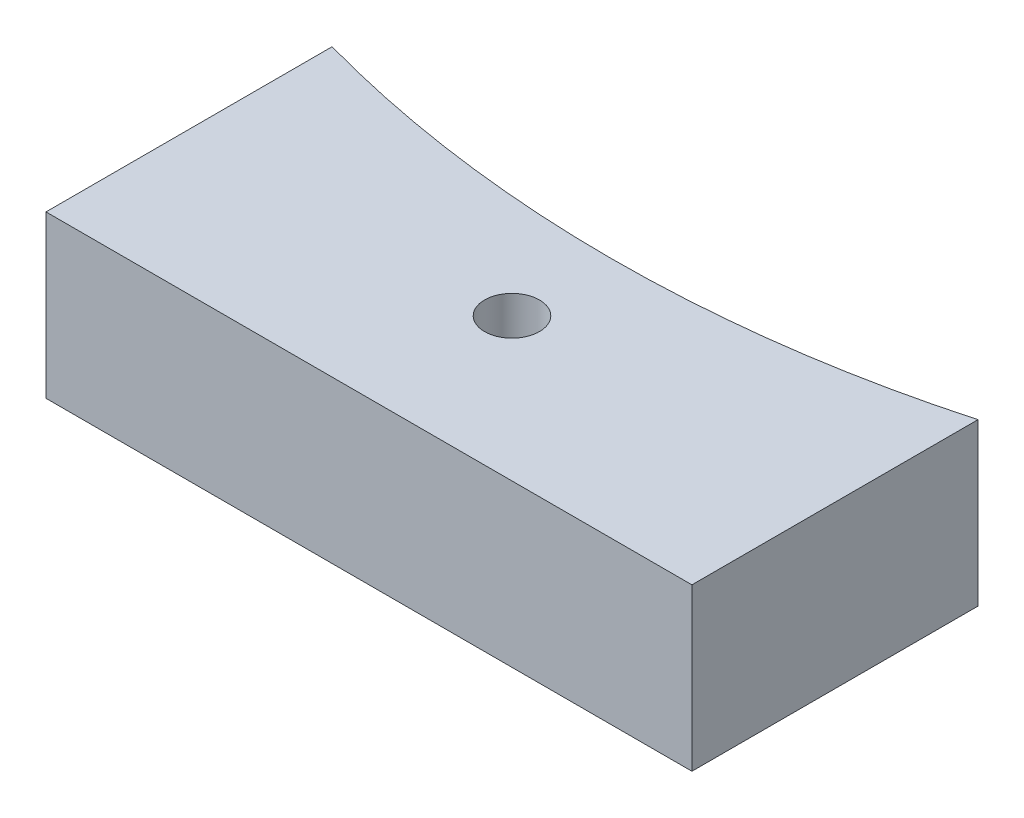
ISO-10303-21;
HEADER;
FILE_DESCRIPTION(('STEP AP214'),'2;1');
FILE_NAME('part.step','',(''),(''),'','','');
FILE_SCHEMA(('AUTOMOTIVE_DESIGN { 1 0 10303 214 1 1 1 1 }'));
ENDSEC;
DATA;
#1=APPLICATION_CONTEXT('core data for automotive mechanical design processes');
#2=APPLICATION_PROTOCOL_DEFINITION('international standard','automotive_design',2000,#1);
#3=PRODUCT_CONTEXT('',#1,'mechanical');
#4=PRODUCT('Part','Part','',(#3));
#5=PRODUCT_RELATED_PRODUCT_CATEGORY('part','',(#4));
#6=PRODUCT_DEFINITION_FORMATION('','',#4);
#7=PRODUCT_DEFINITION_CONTEXT('part definition',#1,'design');
#8=PRODUCT_DEFINITION('design','',#6,#7);
#9=PRODUCT_DEFINITION_SHAPE('','',#8);
#10=(LENGTH_UNIT() NAMED_UNIT(*) SI_UNIT(.MILLI.,.METRE.));
#11=(NAMED_UNIT(*) PLANE_ANGLE_UNIT() SI_UNIT($,.RADIAN.));
#12=(NAMED_UNIT(*) SI_UNIT($,.STERADIAN.) SOLID_ANGLE_UNIT());
#13=UNCERTAINTY_MEASURE_WITH_UNIT(LENGTH_MEASURE(1.E-05),#10,'distance_accuracy_value','');
#14=(GEOMETRIC_REPRESENTATION_CONTEXT(3) GLOBAL_UNCERTAINTY_ASSIGNED_CONTEXT((#13)) GLOBAL_UNIT_ASSIGNED_CONTEXT((#10,
#11,#12)) REPRESENTATION_CONTEXT('',''));
#15=CARTESIAN_POINT('',(0.,0.,0.));
#16=DIRECTION('',(0.,0.,1.));
#17=DIRECTION('',(1.,0.,0.));
#18=AXIS2_PLACEMENT_3D('',#15,#16,#17);
#19=CARTESIAN_POINT('',(39.99999998056,0.,-500000.));
#20=DIRECTION('',(1.,0.,0.));
#21=DIRECTION('',(0.,0.,-1.));
#22=AXIS2_PLACEMENT_3D('',#19,#20,#21);
#23=PLANE('',#22);
#24=DIRECTION('',(0.,1.,0.));
#25=VECTOR('',#24,1.);
#26=CARTESIAN_POINT('',(39.99999998056,0.,180.));
#27=LINE('',#26,#25);
#28=CARTESIAN_POINT('',(39.99999998056,20.,180.));
#29=VERTEX_POINT('',#28);
#30=CARTESIAN_POINT('',(39.99999998056,40.,180.));
#31=VERTEX_POINT('',#30);
#32=EDGE_CURVE('E84',#29,#31,#27,.T.);
#33=ORIENTED_EDGE('',*,*,#32,.F.);
#34=DIRECTION('',(0.,0.,1.));
#35=VECTOR('',#34,1.);
#36=CARTESIAN_POINT('',(39.99999998056,20.,144.568322953388));
#37=LINE('',#36,#35);
#38=CARTESIAN_POINT('',(39.99999998056,20.,144.568322953388));
#39=VERTEX_POINT('',#38);
#40=EDGE_CURVE('E75',#39,#29,#37,.T.);
#41=ORIENTED_EDGE('',*,*,#40,.F.);
#42=DIRECTION('',(0.,-1.,0.));
#43=VECTOR('',#42,1.);
#44=CARTESIAN_POINT('',(39.99999998056,70.,144.568322953388));
#45=LINE('',#44,#43);
#46=CARTESIAN_POINT('',(39.99999998056,40.,144.568322953388));
#47=VERTEX_POINT('',#46);
#48=EDGE_CURVE('E42',#47,#39,#45,.T.);
#49=ORIENTED_EDGE('',*,*,#48,.F.);
#50=DIRECTION('',(0.,0.,1.));
#51=VECTOR('',#50,1.);
#52=CARTESIAN_POINT('',(39.99999998056,40.,-500000.));
#53=LINE('',#52,#51);
#54=EDGE_CURVE('E88',#47,#31,#53,.T.);
#55=ORIENTED_EDGE('',*,*,#54,.T.);
#56=EDGE_LOOP('',(#33,#41,#49,#55));
#57=FACE_BOUND('',#56,.T.);
#58=ADVANCED_FACE('F33',(#57),#23,.T.);
#59=CARTESIAN_POINT('',(0.,0.,180.));
#60=DIRECTION('',(0.,0.,1.));
#61=DIRECTION('',(1.,0.,0.));
#62=AXIS2_PLACEMENT_3D('',#59,#60,#61);
#63=PLANE('',#62);
#64=DIRECTION('',(0.,-1.,0.));
#65=VECTOR('',#64,1.);
#66=CARTESIAN_POINT('',(-39.99999996112,40.,180.));
#67=LINE('',#66,#65);
#68=CARTESIAN_POINT('',(-39.99999996112,40.,180.));
#69=VERTEX_POINT('',#68);
#70=CARTESIAN_POINT('',(-39.99999996112,20.,180.));
#71=VERTEX_POINT('',#70);
#72=EDGE_CURVE('E94',#69,#71,#67,.T.);
#73=ORIENTED_EDGE('',*,*,#72,.T.);
#74=DIRECTION('',(-1.,0.,0.));
#75=VECTOR('',#74,1.);
#76=CARTESIAN_POINT('',(39.99999998056,20.,180.));
#77=LINE('',#76,#75);
#78=EDGE_CURVE('E85',#29,#71,#77,.T.);
#79=ORIENTED_EDGE('',*,*,#78,.F.);
#80=ORIENTED_EDGE('',*,*,#32,.T.);
#81=DIRECTION('',(-1.,0.,0.));
#82=VECTOR('',#81,1.);
#83=CARTESIAN_POINT('',(39.99999998056,40.,180.));
#84=LINE('',#83,#82);
#85=EDGE_CURVE('E93',#31,#69,#84,.T.);
#86=ORIENTED_EDGE('',*,*,#85,.T.);
#87=EDGE_LOOP('',(#73,#79,#80,#86));
#88=FACE_BOUND('',#87,.T.);
#89=ADVANCED_FACE('F111',(#88),#63,.T.);
#90=CARTESIAN_POINT('',(-39.99999996112,40.,-500000.));
#91=DIRECTION('',(-1.,0.,0.));
#92=DIRECTION('',(0.,-1.,0.));
#93=AXIS2_PLACEMENT_3D('',#90,#91,#92);
#94=PLANE('',#93);
#95=DIRECTION('',(0.,-1.,0.));
#96=VECTOR('',#95,1.);
#97=CARTESIAN_POINT('',(-39.99999996112,70.,144.568322958767));
#98=LINE('',#97,#96);
#99=CARTESIAN_POINT('',(-39.99999996112,20.,144.568322958767));
#100=VERTEX_POINT('',#99);
#101=CARTESIAN_POINT('',(-39.99999996112,40.,144.568322958767));
#102=VERTEX_POINT('',#101);
#103=EDGE_CURVE('E37',#100,#102,#98,.F.);
#104=ORIENTED_EDGE('',*,*,#103,.F.);
#105=DIRECTION('',(0.,0.,-1.));
#106=VECTOR('',#105,1.);
#107=CARTESIAN_POINT('',(-39.99999996112,20.,180.));
#108=LINE('',#107,#106);
#109=EDGE_CURVE('E50',#71,#100,#108,.T.);
#110=ORIENTED_EDGE('',*,*,#109,.F.);
#111=ORIENTED_EDGE('',*,*,#72,.F.);
#112=DIRECTION('',(0.,0.,1.));
#113=VECTOR('',#112,1.);
#114=CARTESIAN_POINT('',(-39.99999996112,40.,-500000.));
#115=LINE('',#114,#113);
#116=EDGE_CURVE('E91',#102,#69,#115,.T.);
#117=ORIENTED_EDGE('',*,*,#116,.F.);
#118=EDGE_LOOP('',(#104,#110,#111,#117));
#119=FACE_BOUND('',#118,.T.);
#120=ADVANCED_FACE('F35',(#119),#94,.T.);
#121=CARTESIAN_POINT('',(0.,40.,162.284161474));
#122=DIRECTION('',(0.,1.,0.));
#123=DIRECTION('',(0.,0.,1.));
#124=AXIS2_PLACEMENT_3D('',#121,#122,#123);
#125=CYLINDRICAL_SURFACE('',#124,3.39999999999997);
#126=CARTESIAN_POINT('',(0.,40.,162.284161474));
#127=DIRECTION('',(0.,1.,0.));
#128=DIRECTION('',(0.,0.,1.));
#129=AXIS2_PLACEMENT_3D('',#126,#127,#128);
#130=CIRCLE('',#129,3.39999999999997);
#131=CARTESIAN_POINT('',(0.,40.,165.684161474));
#132=VERTEX_POINT('',#131);
#133=EDGE_CURVE('E97',#132,#132,#130,.T.);
#134=ORIENTED_EDGE('',*,*,#133,.T.);
#135=EDGE_LOOP('',(#134));
#136=FACE_BOUND('',#135,.T.);
#137=CARTESIAN_POINT('',(0.,20.,162.284161474));
#138=DIRECTION('',(0.,-1.,0.));
#139=DIRECTION('',(0.,0.,-1.));
#140=AXIS2_PLACEMENT_3D('',#137,#138,#139);
#141=CIRCLE('',#140,3.39999999999997);
#142=CARTESIAN_POINT('',(0.,20.,158.884161474));
#143=VERTEX_POINT('',#142);
#144=EDGE_CURVE('E103',#143,#143,#141,.F.);
#145=ORIENTED_EDGE('',*,*,#144,.F.);
#146=EDGE_LOOP('',(#145));
#147=FACE_BOUND('',#146,.T.);
#148=ADVANCED_FACE('F124',(#136,#147),#125,.F.);
#149=CARTESIAN_POINT('',(0.,0.,0.));
#150=DIRECTION('',(0.,1.,0.));
#151=DIRECTION('',(0.,0.,1.));
#152=AXIS2_PLACEMENT_3D('',#149,#150,#151);
#153=CYLINDRICAL_SURFACE('',#152,150.);
#154=CARTESIAN_POINT('',(0.,20.,0.));
#155=DIRECTION('',(0.,1.,0.));
#156=DIRECTION('',(0.,0.,-1.));
#157=AXIS2_PLACEMENT_3D('',#154,#155,#156);
#158=CIRCLE('',#157,150.);
#159=EDGE_CURVE('E71',#100,#39,#158,.T.);
#160=ORIENTED_EDGE('',*,*,#159,.F.);
#161=ORIENTED_EDGE('',*,*,#103,.T.);
#162=CARTESIAN_POINT('',(0.,40.,0.));
#163=DIRECTION('',(0.,1.,0.));
#164=DIRECTION('',(-1.,0.,0.));
#165=AXIS2_PLACEMENT_3D('',#162,#163,#164);
#166=CIRCLE('',#165,150.);
#167=EDGE_CURVE('E11',#102,#47,#166,.T.);
#168=ORIENTED_EDGE('',*,*,#167,.T.);
#169=ORIENTED_EDGE('',*,*,#48,.T.);
#170=EDGE_LOOP('',(#160,#161,#168,#169));
#171=FACE_BOUND('',#170,.T.);
#172=ADVANCED_FACE('F87',(#171),#153,.F.);
#173=CARTESIAN_POINT('',(39.99999998056,40.,-500000.));
#174=DIRECTION('',(0.,1.,0.));
#175=DIRECTION('',(-1.,0.,0.));
#176=AXIS2_PLACEMENT_3D('',#173,#174,#175);
#177=PLANE('',#176);
#178=ORIENTED_EDGE('',*,*,#133,.F.);
#179=EDGE_LOOP('',(#178));
#180=FACE_BOUND('',#179,.T.);
#181=ORIENTED_EDGE('',*,*,#167,.F.);
#182=ORIENTED_EDGE('',*,*,#116,.T.);
#183=ORIENTED_EDGE('',*,*,#85,.F.);
#184=ORIENTED_EDGE('',*,*,#54,.F.);
#185=EDGE_LOOP('',(#181,#182,#183,#184));
#186=FACE_BOUND('',#185,.T.);
#187=ADVANCED_FACE('F114',(#180,#186),#177,.T.);
#188=CARTESIAN_POINT('',(0.,20.,0.));
#189=DIRECTION('',(0.,-1.,0.));
#190=DIRECTION('',(0.,0.,-1.));
#191=AXIS2_PLACEMENT_3D('',#188,#189,#190);
#192=PLANE('',#191);
#193=ORIENTED_EDGE('',*,*,#159,.T.);
#194=ORIENTED_EDGE('',*,*,#40,.T.);
#195=ORIENTED_EDGE('',*,*,#78,.T.);
#196=ORIENTED_EDGE('',*,*,#109,.T.);
#197=EDGE_LOOP('',(#193,#194,#195,#196));
#198=FACE_BOUND('',#197,.T.);
#199=ORIENTED_EDGE('',*,*,#144,.T.);
#200=EDGE_LOOP('',(#199));
#201=FACE_BOUND('',#200,.T.);
#202=ADVANCED_FACE('F73',(#198,#201),#192,.T.);
#203=CLOSED_SHELL('',(#58,#89,#120,#148,#172,#187,#202));
#204=MANIFOLD_SOLID_BREP('B2',#203);
#205=ADVANCED_BREP_SHAPE_REPRESENTATION('',(#18,#204),#14);
#206=SHAPE_DEFINITION_REPRESENTATION(#9,#205);
ENDSEC;
END-ISO-10303-21;
